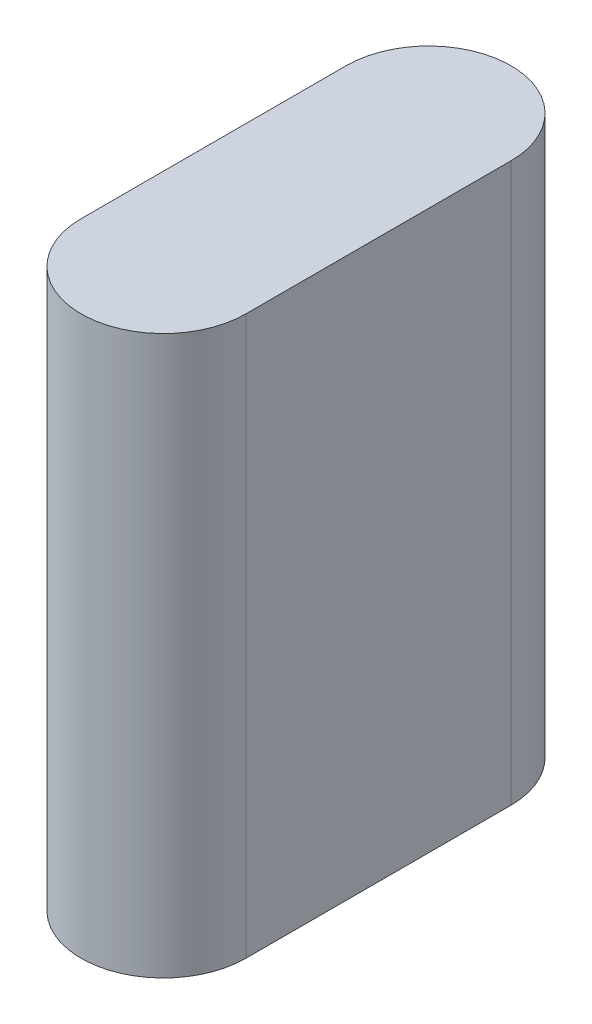
ISO-10303-21;
HEADER;
FILE_DESCRIPTION(('STEP AP214'),'2;1');
FILE_NAME('part.step','',(''),(''),'','','');
FILE_SCHEMA(('AUTOMOTIVE_DESIGN { 1 0 10303 214 1 1 1 1 }'));
ENDSEC;
DATA;
#1=APPLICATION_CONTEXT('core data for automotive mechanical design processes');
#2=APPLICATION_PROTOCOL_DEFINITION('international standard','automotive_design',2000,#1);
#3=PRODUCT_CONTEXT('',#1,'mechanical');
#4=PRODUCT('Part','Part','',(#3));
#5=PRODUCT_RELATED_PRODUCT_CATEGORY('part','',(#4));
#6=PRODUCT_DEFINITION_FORMATION('','',#4);
#7=PRODUCT_DEFINITION_CONTEXT('part definition',#1,'design');
#8=PRODUCT_DEFINITION('design','',#6,#7);
#9=PRODUCT_DEFINITION_SHAPE('','',#8);
#10=(LENGTH_UNIT() NAMED_UNIT(*) SI_UNIT(.MILLI.,.METRE.));
#11=(NAMED_UNIT(*) PLANE_ANGLE_UNIT() SI_UNIT($,.RADIAN.));
#12=(NAMED_UNIT(*) SI_UNIT($,.STERADIAN.) SOLID_ANGLE_UNIT());
#13=UNCERTAINTY_MEASURE_WITH_UNIT(LENGTH_MEASURE(1.E-05),#10,'distance_accuracy_value','');
#14=(GEOMETRIC_REPRESENTATION_CONTEXT(3) GLOBAL_UNCERTAINTY_ASSIGNED_CONTEXT((#13)) GLOBAL_UNIT_ASSIGNED_CONTEXT((#10,
#11,#12)) REPRESENTATION_CONTEXT('',''));
#15=CARTESIAN_POINT('',(0.,0.,0.));
#16=DIRECTION('',(0.,0.,1.));
#17=DIRECTION('',(1.,0.,0.));
#18=AXIS2_PLACEMENT_3D('',#15,#16,#17);
#19=CARTESIAN_POINT('',(0.,101.6,0.));
#20=DIRECTION('',(0.,-1.,0.));
#21=DIRECTION('',(0.,0.,-1.));
#22=AXIS2_PLACEMENT_3D('',#19,#20,#21);
#23=CYLINDRICAL_SURFACE('',#22,15.);
#24=CARTESIAN_POINT('',(0.,0.,0.));
#25=DIRECTION('',(0.,1.,0.));
#26=DIRECTION('',(0.,0.,1.));
#27=AXIS2_PLACEMENT_3D('',#24,#25,#26);
#28=CIRCLE('',#27,15.);
#29=CARTESIAN_POINT('',(-15.,0.,0.));
#30=VERTEX_POINT('',#29);
#31=CARTESIAN_POINT('',(15.,0.,0.));
#32=VERTEX_POINT('',#31);
#33=EDGE_CURVE('E96',#30,#32,#28,.T.);
#34=ORIENTED_EDGE('',*,*,#33,.T.);
#35=DIRECTION('',(0.,-1.,0.));
#36=VECTOR('',#35,1.);
#37=CARTESIAN_POINT('',(15.,101.6,0.));
#38=LINE('',#37,#36);
#39=CARTESIAN_POINT('',(15.,101.6,0.));
#40=VERTEX_POINT('',#39);
#41=EDGE_CURVE('E11',#40,#32,#38,.T.);
#42=ORIENTED_EDGE('',*,*,#41,.F.);
#43=CARTESIAN_POINT('',(0.,101.6,0.));
#44=DIRECTION('',(0.,1.,0.));
#45=DIRECTION('',(0.,0.,1.));
#46=AXIS2_PLACEMENT_3D('',#43,#44,#45);
#47=CIRCLE('',#46,15.);
#48=CARTESIAN_POINT('',(-15.,101.6,0.));
#49=VERTEX_POINT('',#48);
#50=EDGE_CURVE('E84',#49,#40,#47,.T.);
#51=ORIENTED_EDGE('',*,*,#50,.F.);
#52=DIRECTION('',(0.,-1.,0.));
#53=VECTOR('',#52,1.);
#54=CARTESIAN_POINT('',(-15.,101.6,0.));
#55=LINE('',#54,#53);
#56=EDGE_CURVE('E92',#49,#30,#55,.T.);
#57=ORIENTED_EDGE('',*,*,#56,.T.);
#58=EDGE_LOOP('',(#34,#42,#51,#57));
#59=FACE_BOUND('',#58,.T.);
#60=ADVANCED_FACE('F33',(#59),#23,.T.);
#61=CARTESIAN_POINT('',(15.,101.6,0.));
#62=DIRECTION('',(-1.,0.,0.));
#63=DIRECTION('',(0.,0.,1.));
#64=AXIS2_PLACEMENT_3D('',#61,#62,#63);
#65=PLANE('',#64);
#66=DIRECTION('',(0.,0.,-1.));
#67=VECTOR('',#66,1.);
#68=CARTESIAN_POINT('',(15.,0.,0.));
#69=LINE('',#68,#67);
#70=CARTESIAN_POINT('',(15.,0.,-48.26));
#71=VERTEX_POINT('',#70);
#72=EDGE_CURVE('E88',#32,#71,#69,.T.);
#73=ORIENTED_EDGE('',*,*,#72,.T.);
#74=DIRECTION('',(0.,-1.,0.));
#75=VECTOR('',#74,1.);
#76=CARTESIAN_POINT('',(15.,101.6,-48.26));
#77=LINE('',#76,#75);
#78=CARTESIAN_POINT('',(15.,101.6,-48.26));
#79=VERTEX_POINT('',#78);
#80=EDGE_CURVE('E41',#79,#71,#77,.T.);
#81=ORIENTED_EDGE('',*,*,#80,.F.);
#82=DIRECTION('',(0.,0.,-1.));
#83=VECTOR('',#82,1.);
#84=CARTESIAN_POINT('',(15.,101.6,0.));
#85=LINE('',#84,#83);
#86=EDGE_CURVE('E79',#40,#79,#85,.T.);
#87=ORIENTED_EDGE('',*,*,#86,.F.);
#88=ORIENTED_EDGE('',*,*,#41,.T.);
#89=EDGE_LOOP('',(#73,#81,#87,#88));
#90=FACE_BOUND('',#89,.T.);
#91=ADVANCED_FACE('F87',(#90),#65,.F.);
#92=CARTESIAN_POINT('',(0.,101.6,-48.26));
#93=DIRECTION('',(0.,-1.,0.));
#94=DIRECTION('',(0.,0.,-1.));
#95=AXIS2_PLACEMENT_3D('',#92,#93,#94);
#96=CYLINDRICAL_SURFACE('',#95,15.);
#97=CARTESIAN_POINT('',(0.,0.,-48.26));
#98=DIRECTION('',(0.,1.,0.));
#99=DIRECTION('',(0.,0.,1.));
#100=AXIS2_PLACEMENT_3D('',#97,#98,#99);
#101=CIRCLE('',#100,15.);
#102=CARTESIAN_POINT('',(-15.,0.,-48.26));
#103=VERTEX_POINT('',#102);
#104=EDGE_CURVE('E66',#71,#103,#101,.T.);
#105=ORIENTED_EDGE('',*,*,#104,.T.);
#106=DIRECTION('',(0.,-1.,0.));
#107=VECTOR('',#106,1.);
#108=CARTESIAN_POINT('',(-15.,101.6,-48.26));
#109=LINE('',#108,#107);
#110=CARTESIAN_POINT('',(-15.,101.6,-48.26));
#111=VERTEX_POINT('',#110);
#112=EDGE_CURVE('E89',#111,#103,#109,.T.);
#113=ORIENTED_EDGE('',*,*,#112,.F.);
#114=CARTESIAN_POINT('',(0.,101.6,-48.26));
#115=DIRECTION('',(0.,1.,0.));
#116=DIRECTION('',(0.,0.,1.));
#117=AXIS2_PLACEMENT_3D('',#114,#115,#116);
#118=CIRCLE('',#117,15.);
#119=EDGE_CURVE('E82',#79,#111,#118,.T.);
#120=ORIENTED_EDGE('',*,*,#119,.F.);
#121=ORIENTED_EDGE('',*,*,#80,.T.);
#122=EDGE_LOOP('',(#105,#113,#120,#121));
#123=FACE_BOUND('',#122,.T.);
#124=ADVANCED_FACE('F90',(#123),#96,.T.);
#125=CARTESIAN_POINT('',(-15.,101.6,0.));
#126=DIRECTION('',(1.,0.,0.));
#127=DIRECTION('',(0.,0.,-1.));
#128=AXIS2_PLACEMENT_3D('',#125,#126,#127);
#129=PLANE('',#128);
#130=DIRECTION('',(0.,0.,1.));
#131=VECTOR('',#130,1.);
#132=CARTESIAN_POINT('',(-15.,0.,0.));
#133=LINE('',#132,#131);
#134=EDGE_CURVE('E72',#103,#30,#133,.T.);
#135=ORIENTED_EDGE('',*,*,#134,.T.);
#136=ORIENTED_EDGE('',*,*,#56,.F.);
#137=DIRECTION('',(0.,0.,1.));
#138=VECTOR('',#137,1.);
#139=CARTESIAN_POINT('',(-15.,101.6,0.));
#140=LINE('',#139,#138);
#141=EDGE_CURVE('E49',#111,#49,#140,.T.);
#142=ORIENTED_EDGE('',*,*,#141,.F.);
#143=ORIENTED_EDGE('',*,*,#112,.T.);
#144=EDGE_LOOP('',(#135,#136,#142,#143));
#145=FACE_BOUND('',#144,.T.);
#146=ADVANCED_FACE('F103',(#145),#129,.F.);
#147=CARTESIAN_POINT('',(0.,101.6,0.));
#148=DIRECTION('',(0.,1.,0.));
#149=DIRECTION('',(0.,0.,1.));
#150=AXIS2_PLACEMENT_3D('',#147,#148,#149);
#151=PLANE('',#150);
#152=ORIENTED_EDGE('',*,*,#50,.T.);
#153=ORIENTED_EDGE('',*,*,#86,.T.);
#154=ORIENTED_EDGE('',*,*,#119,.T.);
#155=ORIENTED_EDGE('',*,*,#141,.T.);
#156=EDGE_LOOP('',(#152,#153,#154,#155));
#157=FACE_BOUND('',#156,.T.);
#158=ADVANCED_FACE('F80',(#157),#151,.T.);
#159=CARTESIAN_POINT('',(0.,0.,0.));
#160=DIRECTION('',(0.,1.,0.));
#161=DIRECTION('',(0.,0.,1.));
#162=AXIS2_PLACEMENT_3D('',#159,#160,#161);
#163=PLANE('',#162);
#164=ORIENTED_EDGE('',*,*,#33,.F.);
#165=ORIENTED_EDGE('',*,*,#134,.F.);
#166=ORIENTED_EDGE('',*,*,#104,.F.);
#167=ORIENTED_EDGE('',*,*,#72,.F.);
#168=EDGE_LOOP('',(#164,#165,#166,#167));
#169=FACE_BOUND('',#168,.T.);
#170=ADVANCED_FACE('F106',(#169),#163,.F.);
#171=CLOSED_SHELL('',(#60,#91,#124,#146,#158,#170));
#172=MANIFOLD_SOLID_BREP('B2',#171);
#173=ADVANCED_BREP_SHAPE_REPRESENTATION('',(#18,#172),#14);
#174=SHAPE_DEFINITION_REPRESENTATION(#9,#173);
ENDSEC;
END-ISO-10303-21;
